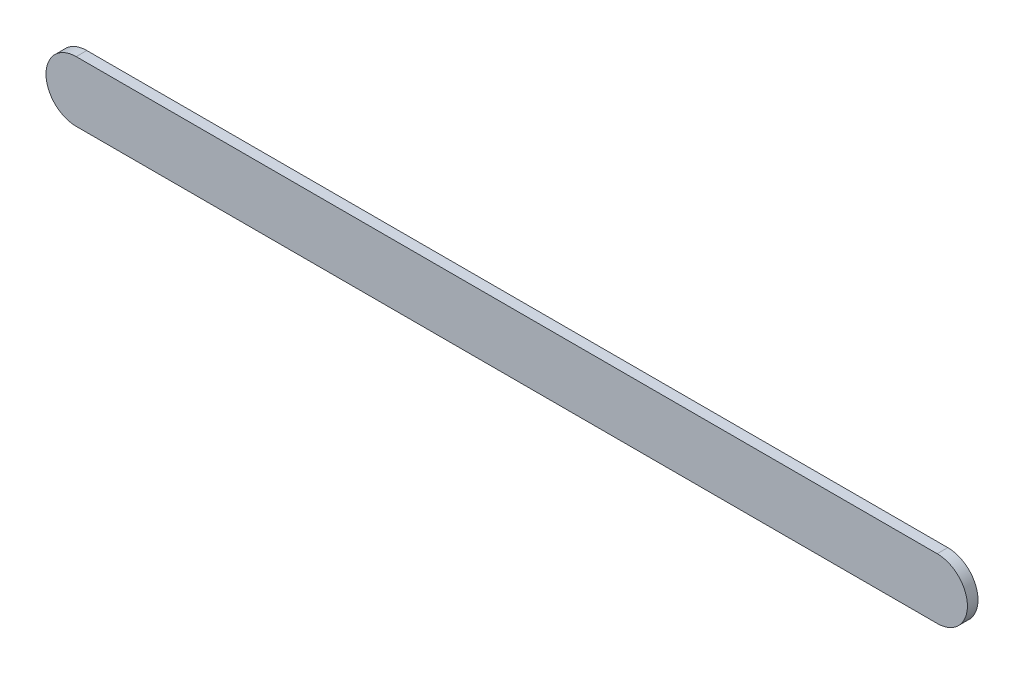
ISO-10303-21;
HEADER;
FILE_DESCRIPTION(('STEP AP214'),'2;1');
FILE_NAME('part.step','',(''),(''),'','','');
FILE_SCHEMA(('AUTOMOTIVE_DESIGN { 1 0 10303 214 1 1 1 1 }'));
ENDSEC;
DATA;
#1=APPLICATION_CONTEXT('core data for automotive mechanical design processes');
#2=APPLICATION_PROTOCOL_DEFINITION('international standard','automotive_design',2000,#1);
#3=PRODUCT_CONTEXT('',#1,'mechanical');
#4=PRODUCT('Part','Part','',(#3));
#5=PRODUCT_RELATED_PRODUCT_CATEGORY('part','',(#4));
#6=PRODUCT_DEFINITION_FORMATION('','',#4);
#7=PRODUCT_DEFINITION_CONTEXT('part definition',#1,'design');
#8=PRODUCT_DEFINITION('design','',#6,#7);
#9=PRODUCT_DEFINITION_SHAPE('','',#8);
#10=(LENGTH_UNIT() NAMED_UNIT(*) SI_UNIT(.MILLI.,.METRE.));
#11=(NAMED_UNIT(*) PLANE_ANGLE_UNIT() SI_UNIT($,.RADIAN.));
#12=(NAMED_UNIT(*) SI_UNIT($,.STERADIAN.) SOLID_ANGLE_UNIT());
#13=UNCERTAINTY_MEASURE_WITH_UNIT(LENGTH_MEASURE(1.E-05),#10,'distance_accuracy_value','');
#14=(GEOMETRIC_REPRESENTATION_CONTEXT(3) GLOBAL_UNCERTAINTY_ASSIGNED_CONTEXT((#13)) GLOBAL_UNIT_ASSIGNED_CONTEXT((#10,
#11,#12)) REPRESENTATION_CONTEXT('',''));
#15=CARTESIAN_POINT('',(0.,0.,0.));
#16=DIRECTION('',(0.,0.,1.));
#17=DIRECTION('',(1.,0.,0.));
#18=AXIS2_PLACEMENT_3D('',#15,#16,#17);
#19=CARTESIAN_POINT('',(105.7,-130.2,1.635));
#20=DIRECTION('',(0.,0.,1.));
#21=DIRECTION('',(1.,0.,0.));
#22=AXIS2_PLACEMENT_3D('',#19,#20,#21);
#23=PLANE('',#22);
#24=DIRECTION('',(-1.,0.,0.));
#25=VECTOR('',#24,1.);
#26=CARTESIAN_POINT('',(105.7,-130.2,1.635));
#27=LINE('',#26,#25);
#28=CARTESIAN_POINT('',(105.7,-130.2,1.635));
#29=VERTEX_POINT('',#28);
#30=CARTESIAN_POINT('',(102.85,-130.2,1.635));
#31=VERTEX_POINT('',#30);
#32=EDGE_CURVE('E83',#29,#31,#27,.T.);
#33=ORIENTED_EDGE('',*,*,#32,.T.);
#34=CARTESIAN_POINT('',(102.85,-130.3,1.635));
#35=DIRECTION('',(0.,0.,1.));
#36=DIRECTION('',(-2.84217094304E-13,1.,0.));
#37=AXIS2_PLACEMENT_3D('',#34,#35,#36);
#38=CIRCLE('',#37,0.1);
#39=CARTESIAN_POINT('',(102.85,-130.4,1.635));
#40=VERTEX_POINT('',#39);
#41=EDGE_CURVE('E104',#31,#40,#38,.T.);
#42=ORIENTED_EDGE('',*,*,#41,.T.);
#43=DIRECTION('',(1.,0.,0.));
#44=VECTOR('',#43,1.);
#45=CARTESIAN_POINT('',(102.85,-130.4,1.635));
#46=LINE('',#45,#44);
#47=CARTESIAN_POINT('',(105.7,-130.4,1.635));
#48=VERTEX_POINT('',#47);
#49=EDGE_CURVE('E20',#40,#48,#46,.T.);
#50=ORIENTED_EDGE('',*,*,#49,.T.);
#51=CARTESIAN_POINT('',(105.7,-130.3,1.635));
#52=DIRECTION('',(0.,0.,1.));
#53=DIRECTION('',(1.42108547152E-13,-1.,0.));
#54=AXIS2_PLACEMENT_3D('',#51,#52,#53);
#55=CIRCLE('',#54,0.1);
#56=EDGE_CURVE('E11',#48,#29,#55,.T.);
#57=ORIENTED_EDGE('',*,*,#56,.T.);
#58=EDGE_LOOP('',(#33,#42,#50,#57));
#59=FACE_BOUND('',#58,.T.);
#60=ADVANCED_FACE('F17',(#59),#23,.T.);
#61=CARTESIAN_POINT('',(105.7,-130.2,1.6));
#62=DIRECTION('',(0.,0.,1.));
#63=DIRECTION('',(1.,0.,0.));
#64=AXIS2_PLACEMENT_3D('',#61,#62,#63);
#65=PLANE('',#64);
#66=CARTESIAN_POINT('',(105.7,-130.3,1.6));
#67=DIRECTION('',(0.,0.,1.));
#68=DIRECTION('',(1.42108547152E-13,-1.,0.));
#69=AXIS2_PLACEMENT_3D('',#66,#67,#68);
#70=CIRCLE('',#69,0.1);
#71=CARTESIAN_POINT('',(105.7,-130.4,1.6));
#72=VERTEX_POINT('',#71);
#73=CARTESIAN_POINT('',(105.7,-130.2,1.6));
#74=VERTEX_POINT('',#73);
#75=EDGE_CURVE('E26',#72,#74,#70,.T.);
#76=ORIENTED_EDGE('',*,*,#75,.F.);
#77=DIRECTION('',(1.,0.,0.));
#78=VECTOR('',#77,1.);
#79=CARTESIAN_POINT('',(102.85,-130.4,1.6));
#80=LINE('',#79,#78);
#81=CARTESIAN_POINT('',(102.85,-130.4,1.6));
#82=VERTEX_POINT('',#81);
#83=EDGE_CURVE('E111',#82,#72,#80,.T.);
#84=ORIENTED_EDGE('',*,*,#83,.F.);
#85=CARTESIAN_POINT('',(102.85,-130.3,1.6));
#86=DIRECTION('',(0.,0.,1.));
#87=DIRECTION('',(-2.84217094304E-13,1.,0.));
#88=AXIS2_PLACEMENT_3D('',#85,#86,#87);
#89=CIRCLE('',#88,0.1);
#90=CARTESIAN_POINT('',(102.85,-130.2,1.6));
#91=VERTEX_POINT('',#90);
#92=EDGE_CURVE('E85',#91,#82,#89,.T.);
#93=ORIENTED_EDGE('',*,*,#92,.F.);
#94=DIRECTION('',(-1.,0.,0.));
#95=VECTOR('',#94,1.);
#96=CARTESIAN_POINT('',(105.7,-130.2,1.6));
#97=LINE('',#96,#95);
#98=EDGE_CURVE('E81',#74,#91,#97,.T.);
#99=ORIENTED_EDGE('',*,*,#98,.F.);
#100=EDGE_LOOP('',(#76,#84,#93,#99));
#101=FACE_BOUND('',#100,.T.);
#102=ADVANCED_FACE('F87',(#101),#65,.F.);
#103=CARTESIAN_POINT('',(105.7,-130.3,1.6));
#104=DIRECTION('',(0.,0.,-1.));
#105=DIRECTION('',(1.42108547152E-13,-1.,0.));
#106=AXIS2_PLACEMENT_3D('',#103,#104,#105);
#107=CYLINDRICAL_SURFACE('',#106,0.1);
#108=ORIENTED_EDGE('',*,*,#75,.T.);
#109=DIRECTION('',(0.,0.,1.));
#110=VECTOR('',#109,1.);
#111=CARTESIAN_POINT('',(105.7,-130.2,1.6));
#112=LINE('',#111,#110);
#113=EDGE_CURVE('E70',#74,#29,#112,.T.);
#114=ORIENTED_EDGE('',*,*,#113,.T.);
#115=ORIENTED_EDGE('',*,*,#56,.F.);
#116=DIRECTION('',(0.,0.,1.));
#117=VECTOR('',#116,1.);
#118=CARTESIAN_POINT('',(105.7,-130.4,1.6));
#119=LINE('',#118,#117);
#120=EDGE_CURVE('E73',#72,#48,#119,.T.);
#121=ORIENTED_EDGE('',*,*,#120,.F.);
#122=EDGE_LOOP('',(#108,#114,#115,#121));
#123=FACE_BOUND('',#122,.T.);
#124=ADVANCED_FACE('F69',(#123),#107,.T.);
#125=CARTESIAN_POINT('',(102.85,-130.4,1.6));
#126=DIRECTION('',(0.,1.,0.));
#127=DIRECTION('',(1.,0.,0.));
#128=AXIS2_PLACEMENT_3D('',#125,#126,#127);
#129=PLANE('',#128);
#130=ORIENTED_EDGE('',*,*,#83,.T.);
#131=ORIENTED_EDGE('',*,*,#120,.T.);
#132=ORIENTED_EDGE('',*,*,#49,.F.);
#133=DIRECTION('',(0.,0.,1.));
#134=VECTOR('',#133,1.);
#135=CARTESIAN_POINT('',(102.85,-130.4,1.6));
#136=LINE('',#135,#134);
#137=EDGE_CURVE('E101',#82,#40,#136,.T.);
#138=ORIENTED_EDGE('',*,*,#137,.F.);
#139=EDGE_LOOP('',(#130,#131,#132,#138));
#140=FACE_BOUND('',#139,.T.);
#141=ADVANCED_FACE('F118',(#140),#129,.F.);
#142=CARTESIAN_POINT('',(102.85,-130.3,1.6));
#143=DIRECTION('',(0.,0.,-1.));
#144=DIRECTION('',(-2.84217094304E-13,1.,0.));
#145=AXIS2_PLACEMENT_3D('',#142,#143,#144);
#146=CYLINDRICAL_SURFACE('',#145,0.1);
#147=ORIENTED_EDGE('',*,*,#92,.T.);
#148=ORIENTED_EDGE('',*,*,#137,.T.);
#149=ORIENTED_EDGE('',*,*,#41,.F.);
#150=DIRECTION('',(0.,0.,1.));
#151=VECTOR('',#150,1.);
#152=CARTESIAN_POINT('',(102.85,-130.2,1.6));
#153=LINE('',#152,#151);
#154=EDGE_CURVE('E91',#91,#31,#153,.T.);
#155=ORIENTED_EDGE('',*,*,#154,.F.);
#156=EDGE_LOOP('',(#147,#148,#149,#155));
#157=FACE_BOUND('',#156,.T.);
#158=ADVANCED_FACE('F120',(#157),#146,.T.);
#159=CARTESIAN_POINT('',(105.7,-130.2,1.6));
#160=DIRECTION('',(0.,-1.,0.));
#161=DIRECTION('',(0.,0.,-1.));
#162=AXIS2_PLACEMENT_3D('',#159,#160,#161);
#163=PLANE('',#162);
#164=ORIENTED_EDGE('',*,*,#98,.T.);
#165=ORIENTED_EDGE('',*,*,#154,.T.);
#166=ORIENTED_EDGE('',*,*,#32,.F.);
#167=ORIENTED_EDGE('',*,*,#113,.F.);
#168=EDGE_LOOP('',(#164,#165,#166,#167));
#169=FACE_BOUND('',#168,.T.);
#170=ADVANCED_FACE('F79',(#169),#163,.F.);
#171=CLOSED_SHELL('',(#60,#102,#124,#141,#158,#170));
#172=MANIFOLD_SOLID_BREP('B1',#171);
#173=ADVANCED_BREP_SHAPE_REPRESENTATION('',(#18,#172),#14);
#174=SHAPE_DEFINITION_REPRESENTATION(#9,#173);
ENDSEC;
END-ISO-10303-21;
